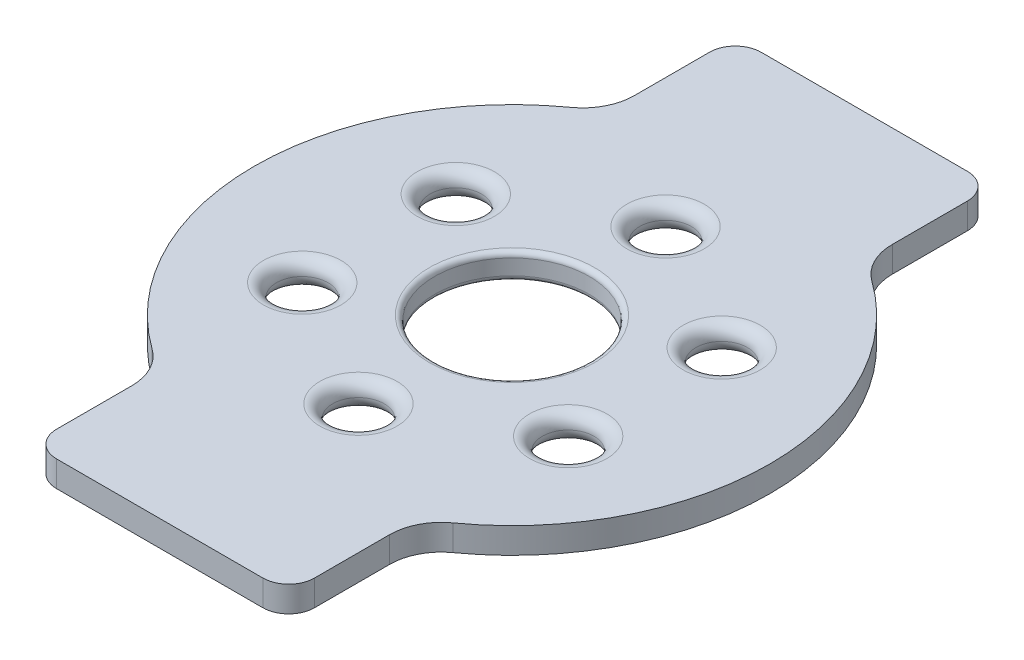
ISO-10303-21;
HEADER;
FILE_DESCRIPTION(('STEP AP214'),'2;1');
FILE_NAME('part.step','',(''),(''),'','','');
FILE_SCHEMA(('AUTOMOTIVE_DESIGN { 1 0 10303 214 1 1 1 1 }'));
ENDSEC;
DATA;
#1=APPLICATION_CONTEXT('core data for automotive mechanical design processes');
#2=APPLICATION_PROTOCOL_DEFINITION('international standard','automotive_design',2000,#1);
#3=PRODUCT_CONTEXT('',#1,'mechanical');
#4=PRODUCT('Part','Part','',(#3));
#5=PRODUCT_RELATED_PRODUCT_CATEGORY('part','',(#4));
#6=PRODUCT_DEFINITION_FORMATION('','',#4);
#7=PRODUCT_DEFINITION_CONTEXT('part definition',#1,'design');
#8=PRODUCT_DEFINITION('design','',#6,#7);
#9=PRODUCT_DEFINITION_SHAPE('','',#8);
#10=(LENGTH_UNIT() NAMED_UNIT(*) SI_UNIT(.MILLI.,.METRE.));
#11=(NAMED_UNIT(*) PLANE_ANGLE_UNIT() SI_UNIT($,.RADIAN.));
#12=(NAMED_UNIT(*) SI_UNIT($,.STERADIAN.) SOLID_ANGLE_UNIT());
#13=UNCERTAINTY_MEASURE_WITH_UNIT(LENGTH_MEASURE(1.E-05),#10,'distance_accuracy_value','');
#14=(GEOMETRIC_REPRESENTATION_CONTEXT(3) GLOBAL_UNCERTAINTY_ASSIGNED_CONTEXT((#13)) GLOBAL_UNIT_ASSIGNED_CONTEXT((#10,
#11,#12)) REPRESENTATION_CONTEXT('',''));
#15=CARTESIAN_POINT('',(0.,0.,0.));
#16=DIRECTION('',(0.,0.,1.));
#17=DIRECTION('',(1.,0.,0.));
#18=AXIS2_PLACEMENT_3D('',#15,#16,#17);
#19=CARTESIAN_POINT('',(0.,10.,0.));
#20=DIRECTION('',(0.,1.,0.));
#21=DIRECTION('',(0.,0.,1.));
#22=AXIS2_PLACEMENT_3D('',#19,#20,#21);
#23=PLANE('',#22);
#24=CARTESIAN_POINT('',(51.5631503641405,10.,29.7699987430039));
#25=DIRECTION('',(0.,1.,0.));
#26=DIRECTION('',(0.,0.,1.));
#27=AXIS2_PLACEMENT_3D('',#24,#25,#26);
#28=CIRCLE('',#27,14.9999999999975);
#29=CARTESIAN_POINT('',(51.5631503641405,10.,44.7699987430015));
#30=VERTEX_POINT('',#29);
#31=EDGE_CURVE('E11',#30,#30,#28,.F.);
#32=ORIENTED_EDGE('',*,*,#31,.T.);
#33=EDGE_LOOP('',(#32));
#34=FACE_BOUND('',#33,.T.);
#35=CARTESIAN_POINT('',(51.5631503641432,10.,-29.7699987429992));
#36=DIRECTION('',(0.,1.,0.));
#37=DIRECTION('',(0.,0.,1.));
#38=AXIS2_PLACEMENT_3D('',#35,#36,#37);
#39=CIRCLE('',#38,14.9999999999959);
#40=CARTESIAN_POINT('',(51.5631503641432,10.,-14.7699987430033));
#41=VERTEX_POINT('',#40);
#42=EDGE_CURVE('E53',#41,#41,#39,.F.);
#43=ORIENTED_EDGE('',*,*,#42,.T.);
#44=EDGE_LOOP('',(#43));
#45=FACE_BOUND('',#44,.T.);
#46=CARTESIAN_POINT('',(-2.06969504090083E-12,10.,59.5399974860015));
#47=DIRECTION('',(0.,1.,0.));
#48=DIRECTION('',(0.,0.,1.));
#49=AXIS2_PLACEMENT_3D('',#46,#47,#48);
#50=CIRCLE('',#49,14.9999999999984);
#51=CARTESIAN_POINT('',(-2.06969504090083E-12,10.,74.5399974859999));
#52=VERTEX_POINT('',#51);
#53=EDGE_CURVE('E345',#52,#52,#50,.F.);
#54=ORIENTED_EDGE('',*,*,#53,.T.);
#55=EDGE_LOOP('',(#54));
#56=FACE_BOUND('',#55,.T.);
#57=CARTESIAN_POINT('',(3.36987392259975E-12,10.,-59.5399974860015));
#58=DIRECTION('',(0.,1.,0.));
#59=DIRECTION('',(0.,0.,1.));
#60=AXIS2_PLACEMENT_3D('',#57,#58,#59);
#61=CIRCLE('',#60,14.9999999999968);
#62=CARTESIAN_POINT('',(3.36987392259975E-12,10.,-44.5399974860048));
#63=VERTEX_POINT('',#62);
#64=EDGE_CURVE('E341',#63,#63,#61,.F.);
#65=ORIENTED_EDGE('',*,*,#64,.T.);
#66=EDGE_LOOP('',(#65));
#67=FACE_BOUND('',#66,.T.);
#68=CARTESIAN_POINT('',(-51.5631503641392,10.,29.7699987429945));
#69=DIRECTION('',(0.,1.,0.));
#70=DIRECTION('',(0.,0.,1.));
#71=AXIS2_PLACEMENT_3D('',#68,#69,#70);
#72=CIRCLE('',#71,14.999999999996);
#73=CARTESIAN_POINT('',(-51.5631503641392,10.,44.7699987429905));
#74=VERTEX_POINT('',#73);
#75=EDGE_CURVE('E337',#74,#74,#72,.F.);
#76=ORIENTED_EDGE('',*,*,#75,.T.);
#77=EDGE_LOOP('',(#76));
#78=FACE_BOUND('',#77,.T.);
#79=CARTESIAN_POINT('',(-51.563150364131,10.,-29.7699987430086));
#80=DIRECTION('',(0.,1.,0.));
#81=DIRECTION('',(0.,0.,1.));
#82=AXIS2_PLACEMENT_3D('',#79,#80,#81);
#83=CIRCLE('',#82,14.9999999999912);
#84=CARTESIAN_POINT('',(-51.563150364131,10.,-14.7699987430174));
#85=VERTEX_POINT('',#84);
#86=EDGE_CURVE('E333',#85,#85,#83,.F.);
#87=ORIENTED_EDGE('',*,*,#86,.T.);
#88=EDGE_LOOP('',(#87));
#89=FACE_BOUND('',#88,.T.);
#90=CARTESIAN_POINT('',(0.,10.,0.));
#91=DIRECTION('',(0.,1.,0.));
#92=DIRECTION('',(0.,0.,1.));
#93=AXIS2_PLACEMENT_3D('',#90,#91,#92);
#94=CIRCLE('',#93,32.);
#95=CARTESIAN_POINT('',(0.,10.,32.));
#96=VERTEX_POINT('',#95);
#97=EDGE_CURVE('E252',#96,#96,#94,.F.);
#98=ORIENTED_EDGE('',*,*,#97,.T.);
#99=EDGE_LOOP('',(#98));
#100=FACE_BOUND('',#99,.T.);
#101=DIRECTION('',(0.,0.,-1.));
#102=VECTOR('',#101,1.);
#103=CARTESIAN_POINT('',(50.,10.,-86.6025403784439));
#104=LINE('',#103,#102);
#105=CARTESIAN_POINT('',(50.,10.,-97.4679434480897));
#106=VERTEX_POINT('',#105);
#107=CARTESIAN_POINT('',(50.,10.,-126.602540378444));
#108=VERTEX_POINT('',#107);
#109=EDGE_CURVE('E178',#106,#108,#104,.T.);
#110=ORIENTED_EDGE('',*,*,#109,.T.);
#111=CARTESIAN_POINT('',(40.,10.,-126.602540378444));
#112=DIRECTION('',(0.,1.,0.));
#113=DIRECTION('',(0.,0.,1.));
#114=AXIS2_PLACEMENT_3D('',#111,#112,#113);
#115=CIRCLE('',#114,10.);
#116=CARTESIAN_POINT('',(40.,10.,-136.602540378444));
#117=VERTEX_POINT('',#116);
#118=EDGE_CURVE('E302',#108,#117,#115,.T.);
#119=ORIENTED_EDGE('',*,*,#118,.T.);
#120=DIRECTION('',(-1.,0.,0.));
#121=VECTOR('',#120,1.);
#122=CARTESIAN_POINT('',(-50.,10.,-136.602540378444));
#123=LINE('',#122,#121);
#124=CARTESIAN_POINT('',(-40.,10.,-136.602540378444));
#125=VERTEX_POINT('',#124);
#126=EDGE_CURVE('E181',#117,#125,#123,.T.);
#127=ORIENTED_EDGE('',*,*,#126,.T.);
#128=CARTESIAN_POINT('',(-40.,10.,-126.602540378444));
#129=DIRECTION('',(0.,1.,0.));
#130=DIRECTION('',(0.,0.,1.));
#131=AXIS2_PLACEMENT_3D('',#128,#129,#130);
#132=CIRCLE('',#131,10.);
#133=CARTESIAN_POINT('',(-50.,10.,-126.602540378444));
#134=VERTEX_POINT('',#133);
#135=EDGE_CURVE('E61',#125,#134,#132,.T.);
#136=ORIENTED_EDGE('',*,*,#135,.T.);
#137=DIRECTION('',(0.,0.,1.));
#138=VECTOR('',#137,1.);
#139=CARTESIAN_POINT('',(-50.,10.,-86.6025403784439));
#140=LINE('',#139,#138);
#141=CARTESIAN_POINT('',(-50.,10.,-97.4679434480897));
#142=VERTEX_POINT('',#141);
#143=EDGE_CURVE('E193',#134,#142,#140,.T.);
#144=ORIENTED_EDGE('',*,*,#143,.T.);
#145=CARTESIAN_POINT('',(-70.,10.,-97.4679434480897));
#146=DIRECTION('',(0.,1.,0.));
#147=DIRECTION('',(0.,0.,1.));
#148=AXIS2_PLACEMENT_3D('',#145,#146,#147);
#149=CIRCLE('',#148,20.);
#150=CARTESIAN_POINT('',(-58.3333333333333,10.,-81.2232862067414));
#151=VERTEX_POINT('',#150);
#152=EDGE_CURVE('E228',#142,#151,#149,.F.);
#153=ORIENTED_EDGE('',*,*,#152,.T.);
#154=CARTESIAN_POINT('',(0.,10.,0.));
#155=DIRECTION('',(0.,1.,0.));
#156=DIRECTION('',(0.,0.,1.));
#157=AXIS2_PLACEMENT_3D('',#154,#155,#156);
#158=CIRCLE('',#157,100.);
#159=CARTESIAN_POINT('',(-58.3333333333333,10.,81.2232862067414));
#160=VERTEX_POINT('',#159);
#161=EDGE_CURVE('E525',#151,#160,#158,.T.);
#162=ORIENTED_EDGE('',*,*,#161,.T.);
#163=CARTESIAN_POINT('',(-70.,10.,97.4679434480897));
#164=DIRECTION('',(0.,1.,0.));
#165=DIRECTION('',(0.,0.,1.));
#166=AXIS2_PLACEMENT_3D('',#163,#164,#165);
#167=CIRCLE('',#166,20.);
#168=CARTESIAN_POINT('',(-50.,10.,97.4679434480897));
#169=VERTEX_POINT('',#168);
#170=EDGE_CURVE('E234',#160,#169,#167,.F.);
#171=ORIENTED_EDGE('',*,*,#170,.T.);
#172=DIRECTION('',(0.,0.,1.));
#173=VECTOR('',#172,1.);
#174=CARTESIAN_POINT('',(-50.,10.,86.6025403784439));
#175=LINE('',#174,#173);
#176=CARTESIAN_POINT('',(-50.,10.,126.602540378444));
#177=VERTEX_POINT('',#176);
#178=EDGE_CURVE('E529',#169,#177,#175,.T.);
#179=ORIENTED_EDGE('',*,*,#178,.T.);
#180=CARTESIAN_POINT('',(-40.,10.,126.602540378444));
#181=DIRECTION('',(0.,1.,0.));
#182=DIRECTION('',(0.,0.,1.));
#183=AXIS2_PLACEMENT_3D('',#180,#181,#182);
#184=CIRCLE('',#183,10.);
#185=CARTESIAN_POINT('',(-40.,10.,136.602540378444));
#186=VERTEX_POINT('',#185);
#187=EDGE_CURVE('E279',#177,#186,#184,.T.);
#188=ORIENTED_EDGE('',*,*,#187,.T.);
#189=DIRECTION('',(1.,0.,0.));
#190=VECTOR('',#189,1.);
#191=CARTESIAN_POINT('',(-50.,10.,136.602540378444));
#192=LINE('',#191,#190);
#193=CARTESIAN_POINT('',(40.,10.,136.602540378444));
#194=VERTEX_POINT('',#193);
#195=EDGE_CURVE('E535',#186,#194,#192,.T.);
#196=ORIENTED_EDGE('',*,*,#195,.T.);
#197=CARTESIAN_POINT('',(40.,10.,126.602540378444));
#198=DIRECTION('',(0.,1.,0.));
#199=DIRECTION('',(0.,0.,1.));
#200=AXIS2_PLACEMENT_3D('',#197,#198,#199);
#201=CIRCLE('',#200,10.);
#202=CARTESIAN_POINT('',(50.,10.,126.602540378444));
#203=VERTEX_POINT('',#202);
#204=EDGE_CURVE('E276',#194,#203,#201,.T.);
#205=ORIENTED_EDGE('',*,*,#204,.T.);
#206=DIRECTION('',(0.,0.,-1.));
#207=VECTOR('',#206,1.);
#208=CARTESIAN_POINT('',(50.,10.,86.6025403784439));
#209=LINE('',#208,#207);
#210=CARTESIAN_POINT('',(50.,10.,97.4679434480897));
#211=VERTEX_POINT('',#210);
#212=EDGE_CURVE('E539',#203,#211,#209,.T.);
#213=ORIENTED_EDGE('',*,*,#212,.T.);
#214=CARTESIAN_POINT('',(70.,10.,97.4679434480897));
#215=DIRECTION('',(0.,1.,0.));
#216=DIRECTION('',(0.,0.,1.));
#217=AXIS2_PLACEMENT_3D('',#214,#215,#216);
#218=CIRCLE('',#217,20.);
#219=CARTESIAN_POINT('',(58.3333333333333,10.,81.2232862067414));
#220=VERTEX_POINT('',#219);
#221=EDGE_CURVE('E241',#211,#220,#218,.F.);
#222=ORIENTED_EDGE('',*,*,#221,.T.);
#223=CARTESIAN_POINT('',(0.,10.,0.));
#224=DIRECTION('',(0.,1.,0.));
#225=DIRECTION('',(0.,0.,1.));
#226=AXIS2_PLACEMENT_3D('',#223,#224,#225);
#227=CIRCLE('',#226,100.);
#228=CARTESIAN_POINT('',(58.3333333333333,10.,-81.2232862067414));
#229=VERTEX_POINT('',#228);
#230=EDGE_CURVE('E516',#220,#229,#227,.T.);
#231=ORIENTED_EDGE('',*,*,#230,.T.);
#232=CARTESIAN_POINT('',(70.,10.,-97.4679434480897));
#233=DIRECTION('',(0.,1.,0.));
#234=DIRECTION('',(0.,0.,1.));
#235=AXIS2_PLACEMENT_3D('',#232,#233,#234);
#236=CIRCLE('',#235,20.);
#237=EDGE_CURVE('E173',#229,#106,#236,.F.);
#238=ORIENTED_EDGE('',*,*,#237,.T.);
#239=EDGE_LOOP('',(#110,#119,#127,#136,#144,#153,#162,#171,#179,#188,#196,#205,#213,#222,#231,#238));
#240=FACE_BOUND('',#239,.T.);
#241=ADVANCED_FACE('F43',(#34,#45,#56,#67,#78,#89,#100,#240),#23,.T.);
#242=CARTESIAN_POINT('',(0.,0.,0.));
#243=DIRECTION('',(0.,1.,0.));
#244=DIRECTION('',(0.,0.,1.));
#245=AXIS2_PLACEMENT_3D('',#242,#243,#244);
#246=PLANE('',#245);
#247=CARTESIAN_POINT('',(51.5631503641405,0.,29.7699987430039));
#248=DIRECTION('',(0.,1.,0.));
#249=DIRECTION('',(0.,0.,1.));
#250=AXIS2_PLACEMENT_3D('',#247,#248,#249);
#251=CIRCLE('',#250,14.9999999999975);
#252=CARTESIAN_POINT('',(51.5631503641405,0.,44.7699987430015));
#253=VERTEX_POINT('',#252);
#254=EDGE_CURVE('E329',#253,#253,#251,.T.);
#255=ORIENTED_EDGE('',*,*,#254,.T.);
#256=EDGE_LOOP('',(#255));
#257=FACE_BOUND('',#256,.T.);
#258=CARTESIAN_POINT('',(51.5631503641432,0.,-29.7699987429992));
#259=DIRECTION('',(0.,1.,0.));
#260=DIRECTION('',(0.,0.,1.));
#261=AXIS2_PLACEMENT_3D('',#258,#259,#260);
#262=CIRCLE('',#261,14.9999999999959);
#263=CARTESIAN_POINT('',(51.5631503641432,0.,-14.7699987430033));
#264=VERTEX_POINT('',#263);
#265=EDGE_CURVE('E325',#264,#264,#262,.T.);
#266=ORIENTED_EDGE('',*,*,#265,.T.);
#267=EDGE_LOOP('',(#266));
#268=FACE_BOUND('',#267,.T.);
#269=CARTESIAN_POINT('',(-2.06969504090083E-12,0.,59.5399974860015));
#270=DIRECTION('',(0.,1.,0.));
#271=DIRECTION('',(0.,0.,1.));
#272=AXIS2_PLACEMENT_3D('',#269,#270,#271);
#273=CIRCLE('',#272,14.9999999999984);
#274=CARTESIAN_POINT('',(-2.06969504090083E-12,0.,74.5399974859999));
#275=VERTEX_POINT('',#274);
#276=EDGE_CURVE('E321',#275,#275,#273,.T.);
#277=ORIENTED_EDGE('',*,*,#276,.T.);
#278=EDGE_LOOP('',(#277));
#279=FACE_BOUND('',#278,.T.);
#280=CARTESIAN_POINT('',(3.36987392259975E-12,0.,-59.5399974860015));
#281=DIRECTION('',(0.,1.,0.));
#282=DIRECTION('',(0.,0.,1.));
#283=AXIS2_PLACEMENT_3D('',#280,#281,#282);
#284=CIRCLE('',#283,14.9999999999968);
#285=CARTESIAN_POINT('',(3.36987392259975E-12,0.,-44.5399974860048));
#286=VERTEX_POINT('',#285);
#287=EDGE_CURVE('E317',#286,#286,#284,.T.);
#288=ORIENTED_EDGE('',*,*,#287,.T.);
#289=EDGE_LOOP('',(#288));
#290=FACE_BOUND('',#289,.T.);
#291=CARTESIAN_POINT('',(-51.5631503641392,0.,29.7699987429945));
#292=DIRECTION('',(0.,1.,0.));
#293=DIRECTION('',(0.,0.,1.));
#294=AXIS2_PLACEMENT_3D('',#291,#292,#293);
#295=CIRCLE('',#294,14.999999999996);
#296=CARTESIAN_POINT('',(-51.5631503641392,0.,44.7699987429905));
#297=VERTEX_POINT('',#296);
#298=EDGE_CURVE('E313',#297,#297,#295,.T.);
#299=ORIENTED_EDGE('',*,*,#298,.T.);
#300=EDGE_LOOP('',(#299));
#301=FACE_BOUND('',#300,.T.);
#302=CARTESIAN_POINT('',(-51.563150364131,0.,-29.7699987430086));
#303=DIRECTION('',(0.,1.,0.));
#304=DIRECTION('',(0.,0.,1.));
#305=AXIS2_PLACEMENT_3D('',#302,#303,#304);
#306=CIRCLE('',#305,14.9999999999912);
#307=CARTESIAN_POINT('',(-51.563150364131,0.,-14.7699987430174));
#308=VERTEX_POINT('',#307);
#309=EDGE_CURVE('E309',#308,#308,#306,.T.);
#310=ORIENTED_EDGE('',*,*,#309,.T.);
#311=EDGE_LOOP('',(#310));
#312=FACE_BOUND('',#311,.T.);
#313=CARTESIAN_POINT('',(0.,0.,0.));
#314=DIRECTION('',(0.,1.,0.));
#315=DIRECTION('',(0.,0.,1.));
#316=AXIS2_PLACEMENT_3D('',#313,#314,#315);
#317=CIRCLE('',#316,32.);
#318=CARTESIAN_POINT('',(0.,0.,32.));
#319=VERTEX_POINT('',#318);
#320=EDGE_CURVE('E256',#319,#319,#317,.T.);
#321=ORIENTED_EDGE('',*,*,#320,.T.);
#322=EDGE_LOOP('',(#321));
#323=FACE_BOUND('',#322,.T.);
#324=DIRECTION('',(-1.,0.,0.));
#325=VECTOR('',#324,1.);
#326=CARTESIAN_POINT('',(-50.,0.,-136.602540378444));
#327=LINE('',#326,#325);
#328=CARTESIAN_POINT('',(40.,0.,-136.602540378444));
#329=VERTEX_POINT('',#328);
#330=CARTESIAN_POINT('',(-40.,0.,-136.602540378444));
#331=VERTEX_POINT('',#330);
#332=EDGE_CURVE('E187',#329,#331,#327,.T.);
#333=ORIENTED_EDGE('',*,*,#332,.F.);
#334=CARTESIAN_POINT('',(40.,0.,-126.602540378444));
#335=DIRECTION('',(0.,1.,0.));
#336=DIRECTION('',(0.,0.,1.));
#337=AXIS2_PLACEMENT_3D('',#334,#335,#336);
#338=CIRCLE('',#337,10.);
#339=CARTESIAN_POINT('',(50.,0.,-126.602540378444));
#340=VERTEX_POINT('',#339);
#341=EDGE_CURVE('E185',#329,#340,#338,.F.);
#342=ORIENTED_EDGE('',*,*,#341,.T.);
#343=DIRECTION('',(0.,0.,-1.));
#344=VECTOR('',#343,1.);
#345=CARTESIAN_POINT('',(50.,0.,-86.6025403784439));
#346=LINE('',#345,#344);
#347=CARTESIAN_POINT('',(50.,0.,-97.4679434480897));
#348=VERTEX_POINT('',#347);
#349=EDGE_CURVE('E177',#348,#340,#346,.T.);
#350=ORIENTED_EDGE('',*,*,#349,.F.);
#351=CARTESIAN_POINT('',(70.,0.,-97.4679434480897));
#352=DIRECTION('',(0.,1.,0.));
#353=DIRECTION('',(0.,0.,1.));
#354=AXIS2_PLACEMENT_3D('',#351,#352,#353);
#355=CIRCLE('',#354,20.);
#356=CARTESIAN_POINT('',(58.3333333333333,0.,-81.2232862067414));
#357=VERTEX_POINT('',#356);
#358=EDGE_CURVE('E162',#348,#357,#355,.T.);
#359=ORIENTED_EDGE('',*,*,#358,.T.);
#360=CARTESIAN_POINT('',(0.,0.,0.));
#361=DIRECTION('',(0.,1.,0.));
#362=DIRECTION('',(0.,0.,1.));
#363=AXIS2_PLACEMENT_3D('',#360,#361,#362);
#364=CIRCLE('',#363,100.);
#365=CARTESIAN_POINT('',(58.3333333333333,0.,81.2232862067414));
#366=VERTEX_POINT('',#365);
#367=EDGE_CURVE('E188',#366,#357,#364,.T.);
#368=ORIENTED_EDGE('',*,*,#367,.F.);
#369=CARTESIAN_POINT('',(70.,0.,97.4679434480897));
#370=DIRECTION('',(0.,1.,0.));
#371=DIRECTION('',(0.,0.,1.));
#372=AXIS2_PLACEMENT_3D('',#369,#370,#371);
#373=CIRCLE('',#372,20.);
#374=CARTESIAN_POINT('',(50.,0.,97.4679434480897));
#375=VERTEX_POINT('',#374);
#376=EDGE_CURVE('E237',#366,#375,#373,.T.);
#377=ORIENTED_EDGE('',*,*,#376,.T.);
#378=DIRECTION('',(0.,0.,-1.));
#379=VECTOR('',#378,1.);
#380=CARTESIAN_POINT('',(50.,0.,86.6025403784439));
#381=LINE('',#380,#379);
#382=CARTESIAN_POINT('',(50.,0.,126.602540378444));
#383=VERTEX_POINT('',#382);
#384=EDGE_CURVE('E195',#383,#375,#381,.T.);
#385=ORIENTED_EDGE('',*,*,#384,.F.);
#386=CARTESIAN_POINT('',(40.,0.,126.602540378444));
#387=DIRECTION('',(0.,1.,0.));
#388=DIRECTION('',(0.,0.,1.));
#389=AXIS2_PLACEMENT_3D('',#386,#387,#388);
#390=CIRCLE('',#389,10.);
#391=CARTESIAN_POINT('',(40.,0.,136.602540378444));
#392=VERTEX_POINT('',#391);
#393=EDGE_CURVE('E267',#383,#392,#390,.F.);
#394=ORIENTED_EDGE('',*,*,#393,.T.);
#395=DIRECTION('',(1.,0.,0.));
#396=VECTOR('',#395,1.);
#397=CARTESIAN_POINT('',(-50.,0.,136.602540378444));
#398=LINE('',#397,#396);
#399=CARTESIAN_POINT('',(-40.,0.,136.602540378444));
#400=VERTEX_POINT('',#399);
#401=EDGE_CURVE('E556',#400,#392,#398,.T.);
#402=ORIENTED_EDGE('',*,*,#401,.F.);
#403=CARTESIAN_POINT('',(-40.,0.,126.602540378444));
#404=DIRECTION('',(0.,1.,0.));
#405=DIRECTION('',(0.,0.,1.));
#406=AXIS2_PLACEMENT_3D('',#403,#404,#405);
#407=CIRCLE('',#406,10.);
#408=CARTESIAN_POINT('',(-50.,0.,126.602540378444));
#409=VERTEX_POINT('',#408);
#410=EDGE_CURVE('E270',#400,#409,#407,.F.);
#411=ORIENTED_EDGE('',*,*,#410,.T.);
#412=DIRECTION('',(0.,0.,1.));
#413=VECTOR('',#412,1.);
#414=CARTESIAN_POINT('',(-50.,0.,86.6025403784439));
#415=LINE('',#414,#413);
#416=CARTESIAN_POINT('',(-50.,0.,97.4679434480897));
#417=VERTEX_POINT('',#416);
#418=EDGE_CURVE('E552',#417,#409,#415,.T.);
#419=ORIENTED_EDGE('',*,*,#418,.F.);
#420=CARTESIAN_POINT('',(-70.,0.,97.4679434480897));
#421=DIRECTION('',(0.,1.,0.));
#422=DIRECTION('',(0.,0.,1.));
#423=AXIS2_PLACEMENT_3D('',#420,#421,#422);
#424=CIRCLE('',#423,20.);
#425=CARTESIAN_POINT('',(-58.3333333333333,0.,81.2232862067414));
#426=VERTEX_POINT('',#425);
#427=EDGE_CURVE('E231',#417,#426,#424,.T.);
#428=ORIENTED_EDGE('',*,*,#427,.T.);
#429=CARTESIAN_POINT('',(0.,0.,0.));
#430=DIRECTION('',(0.,1.,0.));
#431=DIRECTION('',(0.,0.,1.));
#432=AXIS2_PLACEMENT_3D('',#429,#430,#431);
#433=CIRCLE('',#432,100.);
#434=CARTESIAN_POINT('',(-58.3333333333333,0.,-81.2232862067414));
#435=VERTEX_POINT('',#434);
#436=EDGE_CURVE('E548',#435,#426,#433,.T.);
#437=ORIENTED_EDGE('',*,*,#436,.F.);
#438=CARTESIAN_POINT('',(-70.,0.,-97.4679434480897));
#439=DIRECTION('',(0.,1.,0.));
#440=DIRECTION('',(0.,0.,1.));
#441=AXIS2_PLACEMENT_3D('',#438,#439,#440);
#442=CIRCLE('',#441,20.);
#443=CARTESIAN_POINT('',(-50.,0.,-97.4679434480897));
#444=VERTEX_POINT('',#443);
#445=EDGE_CURVE('E224',#435,#444,#442,.T.);
#446=ORIENTED_EDGE('',*,*,#445,.T.);
#447=DIRECTION('',(0.,0.,1.));
#448=VECTOR('',#447,1.);
#449=CARTESIAN_POINT('',(-50.,0.,-86.6025403784439));
#450=LINE('',#449,#448);
#451=CARTESIAN_POINT('',(-50.,0.,-126.602540378444));
#452=VERTEX_POINT('',#451);
#453=EDGE_CURVE('E356',#452,#444,#450,.T.);
#454=ORIENTED_EDGE('',*,*,#453,.F.);
#455=CARTESIAN_POINT('',(-40.,0.,-126.602540378444));
#456=DIRECTION('',(0.,1.,0.));
#457=DIRECTION('',(0.,0.,1.));
#458=AXIS2_PLACEMENT_3D('',#455,#456,#457);
#459=CIRCLE('',#458,10.);
#460=EDGE_CURVE('E293',#452,#331,#459,.F.);
#461=ORIENTED_EDGE('',*,*,#460,.T.);
#462=EDGE_LOOP('',(#333,#342,#350,#359,#368,#377,#385,#394,#402,#411,#419,#428,#437,#446,#454,#461));
#463=FACE_BOUND('',#462,.T.);
#464=ADVANCED_FACE('F184',(#257,#268,#279,#290,#301,#312,#323,#463),#246,.F.);
#465=CARTESIAN_POINT('',(-50.,10.,-86.6025403784439));
#466=DIRECTION('',(1.,0.,0.));
#467=DIRECTION('',(0.,0.,-1.));
#468=AXIS2_PLACEMENT_3D('',#465,#466,#467);
#469=PLANE('',#468);
#470=ORIENTED_EDGE('',*,*,#143,.F.);
#471=DIRECTION('',(0.,-1.,0.));
#472=VECTOR('',#471,1.);
#473=CARTESIAN_POINT('',(-50.,10.,-126.602540378444));
#474=LINE('',#473,#472);
#475=EDGE_CURVE('E305',#134,#452,#474,.T.);
#476=ORIENTED_EDGE('',*,*,#475,.T.);
#477=ORIENTED_EDGE('',*,*,#453,.T.);
#478=DIRECTION('',(0.,1.,0.));
#479=VECTOR('',#478,1.);
#480=CARTESIAN_POINT('',(-50.,10.,-97.4679434480897));
#481=LINE('',#480,#479);
#482=EDGE_CURVE('E211',#444,#142,#481,.T.);
#483=ORIENTED_EDGE('',*,*,#482,.T.);
#484=EDGE_LOOP('',(#470,#476,#477,#483));
#485=FACE_BOUND('',#484,.T.);
#486=ADVANCED_FACE('F396',(#485),#469,.F.);
#487=CARTESIAN_POINT('',(0.,10.,0.));
#488=DIRECTION('',(0.,-1.,0.));
#489=DIRECTION('',(0.,0.,-1.));
#490=AXIS2_PLACEMENT_3D('',#487,#488,#489);
#491=CYLINDRICAL_SURFACE('',#490,100.);
#492=ORIENTED_EDGE('',*,*,#161,.F.);
#493=DIRECTION('',(0.,-1.,0.));
#494=VECTOR('',#493,1.);
#495=CARTESIAN_POINT('',(-58.3333333333333,10.,-81.2232862067414));
#496=LINE('',#495,#494);
#497=EDGE_CURVE('E207',#151,#435,#496,.T.);
#498=ORIENTED_EDGE('',*,*,#497,.T.);
#499=ORIENTED_EDGE('',*,*,#436,.T.);
#500=DIRECTION('',(0.,-1.,0.));
#501=VECTOR('',#500,1.);
#502=CARTESIAN_POINT('',(-58.3333333333333,10.,81.2232862067414));
#503=LINE('',#502,#501);
#504=EDGE_CURVE('E204',#426,#160,#503,.F.);
#505=ORIENTED_EDGE('',*,*,#504,.T.);
#506=EDGE_LOOP('',(#492,#498,#499,#505));
#507=FACE_BOUND('',#506,.T.);
#508=ADVANCED_FACE('F424',(#507),#491,.T.);
#509=CARTESIAN_POINT('',(-50.,10.,86.6025403784439));
#510=DIRECTION('',(1.,0.,0.));
#511=DIRECTION('',(0.,0.,-1.));
#512=AXIS2_PLACEMENT_3D('',#509,#510,#511);
#513=PLANE('',#512);
#514=ORIENTED_EDGE('',*,*,#418,.T.);
#515=DIRECTION('',(0.,-1.,0.));
#516=VECTOR('',#515,1.);
#517=CARTESIAN_POINT('',(-50.,10.,126.602540378444));
#518=LINE('',#517,#516);
#519=EDGE_CURVE('E273',#409,#177,#518,.F.);
#520=ORIENTED_EDGE('',*,*,#519,.T.);
#521=ORIENTED_EDGE('',*,*,#178,.F.);
#522=DIRECTION('',(0.,1.,0.));
#523=VECTOR('',#522,1.);
#524=CARTESIAN_POINT('',(-50.,0.,97.4679434480897));
#525=LINE('',#524,#523);
#526=EDGE_CURVE('E215',#169,#417,#525,.F.);
#527=ORIENTED_EDGE('',*,*,#526,.T.);
#528=EDGE_LOOP('',(#514,#520,#521,#527));
#529=FACE_BOUND('',#528,.T.);
#530=ADVANCED_FACE('F420',(#529),#513,.F.);
#531=CARTESIAN_POINT('',(-50.,10.,136.602540378444));
#532=DIRECTION('',(0.,0.,-1.));
#533=DIRECTION('',(-1.,0.,0.));
#534=AXIS2_PLACEMENT_3D('',#531,#532,#533);
#535=PLANE('',#534);
#536=ORIENTED_EDGE('',*,*,#195,.F.);
#537=DIRECTION('',(0.,-1.,0.));
#538=VECTOR('',#537,1.);
#539=CARTESIAN_POINT('',(-40.,10.,136.602540378444));
#540=LINE('',#539,#538);
#541=EDGE_CURVE('E263',#186,#400,#540,.T.);
#542=ORIENTED_EDGE('',*,*,#541,.T.);
#543=ORIENTED_EDGE('',*,*,#401,.T.);
#544=DIRECTION('',(0.,-1.,0.));
#545=VECTOR('',#544,1.);
#546=CARTESIAN_POINT('',(40.,10.,136.602540378444));
#547=LINE('',#546,#545);
#548=EDGE_CURVE('E260',#392,#194,#547,.F.);
#549=ORIENTED_EDGE('',*,*,#548,.T.);
#550=EDGE_LOOP('',(#536,#542,#543,#549));
#551=FACE_BOUND('',#550,.T.);
#552=ADVANCED_FACE('F416',(#551),#535,.F.);
#553=CARTESIAN_POINT('',(50.,10.,86.6025403784439));
#554=DIRECTION('',(-1.,0.,0.));
#555=DIRECTION('',(0.,0.,1.));
#556=AXIS2_PLACEMENT_3D('',#553,#554,#555);
#557=PLANE('',#556);
#558=ORIENTED_EDGE('',*,*,#212,.F.);
#559=DIRECTION('',(0.,-1.,0.));
#560=VECTOR('',#559,1.);
#561=CARTESIAN_POINT('',(50.,10.,126.602540378444));
#562=LINE('',#561,#560);
#563=EDGE_CURVE('E282',#203,#383,#562,.T.);
#564=ORIENTED_EDGE('',*,*,#563,.T.);
#565=ORIENTED_EDGE('',*,*,#384,.T.);
#566=DIRECTION('',(0.,1.,0.));
#567=VECTOR('',#566,1.);
#568=CARTESIAN_POINT('',(50.,10.,97.4679434480897));
#569=LINE('',#568,#567);
#570=EDGE_CURVE('E174',#375,#211,#569,.T.);
#571=ORIENTED_EDGE('',*,*,#570,.T.);
#572=EDGE_LOOP('',(#558,#564,#565,#571));
#573=FACE_BOUND('',#572,.T.);
#574=ADVANCED_FACE('F412',(#573),#557,.F.);
#575=CARTESIAN_POINT('',(0.,10.,0.));
#576=DIRECTION('',(0.,-1.,0.));
#577=DIRECTION('',(0.,0.,-1.));
#578=AXIS2_PLACEMENT_3D('',#575,#576,#577);
#579=CYLINDRICAL_SURFACE('',#578,100.);
#580=ORIENTED_EDGE('',*,*,#367,.T.);
#581=DIRECTION('',(0.,-1.,0.));
#582=VECTOR('',#581,1.);
#583=CARTESIAN_POINT('',(58.3333333333333,10.,-81.2232862067414));
#584=LINE('',#583,#582);
#585=EDGE_CURVE('E167',#357,#229,#584,.F.);
#586=ORIENTED_EDGE('',*,*,#585,.T.);
#587=ORIENTED_EDGE('',*,*,#230,.F.);
#588=DIRECTION('',(0.,-1.,0.));
#589=VECTOR('',#588,1.);
#590=CARTESIAN_POINT('',(58.3333333333333,10.,81.2232862067414));
#591=LINE('',#590,#589);
#592=EDGE_CURVE('E180',#220,#366,#591,.T.);
#593=ORIENTED_EDGE('',*,*,#592,.T.);
#594=EDGE_LOOP('',(#580,#586,#587,#593));
#595=FACE_BOUND('',#594,.T.);
#596=ADVANCED_FACE('F409',(#595),#579,.T.);
#597=CARTESIAN_POINT('',(50.,10.,-86.6025403784439));
#598=DIRECTION('',(-1.,0.,0.));
#599=DIRECTION('',(0.,0.,1.));
#600=AXIS2_PLACEMENT_3D('',#597,#598,#599);
#601=PLANE('',#600);
#602=ORIENTED_EDGE('',*,*,#349,.T.);
#603=DIRECTION('',(0.,-1.,0.));
#604=VECTOR('',#603,1.);
#605=CARTESIAN_POINT('',(50.,10.,-126.602540378444));
#606=LINE('',#605,#604);
#607=EDGE_CURVE('E69',#340,#108,#606,.F.);
#608=ORIENTED_EDGE('',*,*,#607,.T.);
#609=ORIENTED_EDGE('',*,*,#109,.F.);
#610=DIRECTION('',(0.,1.,0.));
#611=VECTOR('',#610,1.);
#612=CARTESIAN_POINT('',(50.,0.,-97.4679434480897));
#613=LINE('',#612,#611);
#614=EDGE_CURVE('E166',#106,#348,#613,.F.);
#615=ORIENTED_EDGE('',*,*,#614,.T.);
#616=EDGE_LOOP('',(#602,#608,#609,#615));
#617=FACE_BOUND('',#616,.T.);
#618=ADVANCED_FACE('F176',(#617),#601,.F.);
#619=CARTESIAN_POINT('',(-50.,10.,-136.602540378444));
#620=DIRECTION('',(0.,0.,1.));
#621=DIRECTION('',(1.,0.,0.));
#622=AXIS2_PLACEMENT_3D('',#619,#620,#621);
#623=PLANE('',#622);
#624=ORIENTED_EDGE('',*,*,#126,.F.);
#625=DIRECTION('',(0.,-1.,0.));
#626=VECTOR('',#625,1.);
#627=CARTESIAN_POINT('',(40.,10.,-136.602540378444));
#628=LINE('',#627,#626);
#629=EDGE_CURVE('E289',#117,#329,#628,.T.);
#630=ORIENTED_EDGE('',*,*,#629,.T.);
#631=ORIENTED_EDGE('',*,*,#332,.T.);
#632=DIRECTION('',(0.,-1.,0.));
#633=VECTOR('',#632,1.);
#634=CARTESIAN_POINT('',(-40.,10.,-136.602540378444));
#635=LINE('',#634,#633);
#636=EDGE_CURVE('E286',#331,#125,#635,.F.);
#637=ORIENTED_EDGE('',*,*,#636,.T.);
#638=EDGE_LOOP('',(#624,#630,#631,#637));
#639=FACE_BOUND('',#638,.T.);
#640=ADVANCED_FACE('F403',(#639),#623,.F.);
#641=CARTESIAN_POINT('',(0.,10.,0.));
#642=DIRECTION('',(0.,-1.,0.));
#643=DIRECTION('',(0.,0.,-1.));
#644=AXIS2_PLACEMENT_3D('',#641,#642,#643);
#645=CYLINDRICAL_SURFACE('',#644,30.);
#646=CARTESIAN_POINT('',(0.,8.,0.));
#647=DIRECTION('',(0.,1.,0.));
#648=DIRECTION('',(0.,0.,1.));
#649=AXIS2_PLACEMENT_3D('',#646,#647,#648);
#650=CIRCLE('',#649,30.);
#651=CARTESIAN_POINT('',(0.,8.,30.));
#652=VERTEX_POINT('',#651);
#653=EDGE_CURVE('E248',#652,#652,#650,.T.);
#654=ORIENTED_EDGE('',*,*,#653,.T.);
#655=EDGE_LOOP('',(#654));
#656=FACE_BOUND('',#655,.T.);
#657=CARTESIAN_POINT('',(0.,2.,0.));
#658=DIRECTION('',(0.,1.,0.));
#659=DIRECTION('',(0.,0.,1.));
#660=AXIS2_PLACEMENT_3D('',#657,#658,#659);
#661=CIRCLE('',#660,30.);
#662=CARTESIAN_POINT('',(0.,2.,30.));
#663=VERTEX_POINT('',#662);
#664=EDGE_CURVE('E244',#663,#663,#661,.F.);
#665=ORIENTED_EDGE('',*,*,#664,.T.);
#666=EDGE_LOOP('',(#665));
#667=FACE_BOUND('',#666,.T.);
#668=ADVANCED_FACE('F401',(#656,#667),#645,.F.);
#669=CARTESIAN_POINT('',(70.,10.,-97.4679434480897));
#670=DIRECTION('',(0.,-1.,0.));
#671=DIRECTION('',(0.,0.,-1.));
#672=AXIS2_PLACEMENT_3D('',#669,#670,#671);
#673=CYLINDRICAL_SURFACE('',#672,20.);
#674=ORIENTED_EDGE('',*,*,#237,.F.);
#675=ORIENTED_EDGE('',*,*,#585,.F.);
#676=ORIENTED_EDGE('',*,*,#358,.F.);
#677=ORIENTED_EDGE('',*,*,#614,.F.);
#678=EDGE_LOOP('',(#674,#675,#676,#677));
#679=FACE_BOUND('',#678,.T.);
#680=ADVANCED_FACE('F165',(#679),#673,.F.);
#681=CARTESIAN_POINT('',(-70.,10.,-97.4679434480897));
#682=DIRECTION('',(0.,-1.,0.));
#683=DIRECTION('',(0.,0.,-1.));
#684=AXIS2_PLACEMENT_3D('',#681,#682,#683);
#685=CYLINDRICAL_SURFACE('',#684,20.);
#686=ORIENTED_EDGE('',*,*,#152,.F.);
#687=ORIENTED_EDGE('',*,*,#482,.F.);
#688=ORIENTED_EDGE('',*,*,#445,.F.);
#689=ORIENTED_EDGE('',*,*,#497,.F.);
#690=EDGE_LOOP('',(#686,#687,#688,#689));
#691=FACE_BOUND('',#690,.T.);
#692=ADVANCED_FACE('F434',(#691),#685,.F.);
#693=CARTESIAN_POINT('',(-70.,10.,97.4679434480897));
#694=DIRECTION('',(0.,-1.,0.));
#695=DIRECTION('',(0.,0.,-1.));
#696=AXIS2_PLACEMENT_3D('',#693,#694,#695);
#697=CYLINDRICAL_SURFACE('',#696,20.);
#698=ORIENTED_EDGE('',*,*,#170,.F.);
#699=ORIENTED_EDGE('',*,*,#504,.F.);
#700=ORIENTED_EDGE('',*,*,#427,.F.);
#701=ORIENTED_EDGE('',*,*,#526,.F.);
#702=EDGE_LOOP('',(#698,#699,#700,#701));
#703=FACE_BOUND('',#702,.T.);
#704=ADVANCED_FACE('F437',(#703),#697,.F.);
#705=CARTESIAN_POINT('',(70.,10.,97.4679434480897));
#706=DIRECTION('',(0.,-1.,0.));
#707=DIRECTION('',(0.,0.,-1.));
#708=AXIS2_PLACEMENT_3D('',#705,#706,#707);
#709=CYLINDRICAL_SURFACE('',#708,20.);
#710=ORIENTED_EDGE('',*,*,#221,.F.);
#711=ORIENTED_EDGE('',*,*,#570,.F.);
#712=ORIENTED_EDGE('',*,*,#376,.F.);
#713=ORIENTED_EDGE('',*,*,#592,.F.);
#714=EDGE_LOOP('',(#710,#711,#712,#713));
#715=FACE_BOUND('',#714,.T.);
#716=ADVANCED_FACE('F441',(#715),#709,.F.);
#717=CARTESIAN_POINT('',(0.,8.,0.));
#718=DIRECTION('',(0.,1.,0.));
#719=DIRECTION('',(0.,0.,1.));
#720=AXIS2_PLACEMENT_3D('',#717,#718,#719);
#721=TOROIDAL_SURFACE('',#720,32.,2.);
#722=ORIENTED_EDGE('',*,*,#97,.F.);
#723=EDGE_LOOP('',(#722));
#724=FACE_BOUND('',#723,.T.);
#725=ORIENTED_EDGE('',*,*,#653,.F.);
#726=EDGE_LOOP('',(#725));
#727=FACE_BOUND('',#726,.T.);
#728=ADVANCED_FACE('F445',(#724,#727),#721,.T.);
#729=CARTESIAN_POINT('',(0.,2.,0.));
#730=DIRECTION('',(0.,1.,0.));
#731=DIRECTION('',(0.,0.,1.));
#732=AXIS2_PLACEMENT_3D('',#729,#730,#731);
#733=TOROIDAL_SURFACE('',#732,32.,2.);
#734=ORIENTED_EDGE('',*,*,#664,.F.);
#735=EDGE_LOOP('',(#734));
#736=FACE_BOUND('',#735,.T.);
#737=ORIENTED_EDGE('',*,*,#320,.F.);
#738=EDGE_LOOP('',(#737));
#739=FACE_BOUND('',#738,.T.);
#740=ADVANCED_FACE('F449',(#736,#739),#733,.T.);
#741=CARTESIAN_POINT('',(-40.,10.,126.602540378444));
#742=DIRECTION('',(0.,-1.,0.));
#743=DIRECTION('',(0.,0.,-1.));
#744=AXIS2_PLACEMENT_3D('',#741,#742,#743);
#745=CYLINDRICAL_SURFACE('',#744,10.);
#746=ORIENTED_EDGE('',*,*,#187,.F.);
#747=ORIENTED_EDGE('',*,*,#519,.F.);
#748=ORIENTED_EDGE('',*,*,#410,.F.);
#749=ORIENTED_EDGE('',*,*,#541,.F.);
#750=EDGE_LOOP('',(#746,#747,#748,#749));
#751=FACE_BOUND('',#750,.T.);
#752=ADVANCED_FACE('F453',(#751),#745,.T.);
#753=CARTESIAN_POINT('',(40.,10.,126.602540378444));
#754=DIRECTION('',(0.,-1.,0.));
#755=DIRECTION('',(0.,0.,-1.));
#756=AXIS2_PLACEMENT_3D('',#753,#754,#755);
#757=CYLINDRICAL_SURFACE('',#756,10.);
#758=ORIENTED_EDGE('',*,*,#204,.F.);
#759=ORIENTED_EDGE('',*,*,#548,.F.);
#760=ORIENTED_EDGE('',*,*,#393,.F.);
#761=ORIENTED_EDGE('',*,*,#563,.F.);
#762=EDGE_LOOP('',(#758,#759,#760,#761));
#763=FACE_BOUND('',#762,.T.);
#764=ADVANCED_FACE('F457',(#763),#757,.T.);
#765=CARTESIAN_POINT('',(40.,10.,-126.602540378444));
#766=DIRECTION('',(0.,-1.,0.));
#767=DIRECTION('',(0.,0.,-1.));
#768=AXIS2_PLACEMENT_3D('',#765,#766,#767);
#769=CYLINDRICAL_SURFACE('',#768,10.);
#770=ORIENTED_EDGE('',*,*,#118,.F.);
#771=ORIENTED_EDGE('',*,*,#607,.F.);
#772=ORIENTED_EDGE('',*,*,#341,.F.);
#773=ORIENTED_EDGE('',*,*,#629,.F.);
#774=EDGE_LOOP('',(#770,#771,#772,#773));
#775=FACE_BOUND('',#774,.T.);
#776=ADVANCED_FACE('F461',(#775),#769,.T.);
#777=CARTESIAN_POINT('',(-40.,10.,-126.602540378444));
#778=DIRECTION('',(0.,-1.,0.));
#779=DIRECTION('',(0.,0.,-1.));
#780=AXIS2_PLACEMENT_3D('',#777,#778,#779);
#781=CYLINDRICAL_SURFACE('',#780,10.);
#782=ORIENTED_EDGE('',*,*,#135,.F.);
#783=ORIENTED_EDGE('',*,*,#636,.F.);
#784=ORIENTED_EDGE('',*,*,#460,.F.);
#785=ORIENTED_EDGE('',*,*,#475,.F.);
#786=EDGE_LOOP('',(#782,#783,#784,#785));
#787=FACE_BOUND('',#786,.T.);
#788=ADVANCED_FACE('F465',(#787),#781,.T.);
#789=CARTESIAN_POINT('',(51.5631503641405,5.,29.7699987430039));
#790=DIRECTION('',(0.,1.,0.));
#791=DIRECTION('',(0.,0.,1.));
#792=AXIS2_PLACEMENT_3D('',#789,#790,#791);
#793=TOROIDAL_SURFACE('',#792,14.9999999999975,5.);
#794=ORIENTED_EDGE('',*,*,#31,.F.);
#795=EDGE_LOOP('',(#794));
#796=FACE_BOUND('',#795,.T.);
#797=CARTESIAN_POINT('',(51.5631503641405,5.,29.7699987430039));
#798=DIRECTION('',(0.,1.,0.));
#799=DIRECTION('',(0.,0.,1.));
#800=AXIS2_PLACEMENT_3D('',#797,#798,#799);
#801=CIRCLE('',#800,9.99999999999754);
#802=CARTESIAN_POINT('',(51.5631503641405,5.,39.7699987430015));
#803=VERTEX_POINT('',#802);
#804=EDGE_CURVE('E352',#803,#803,#801,.T.);
#805=ORIENTED_EDGE('',*,*,#804,.F.);
#806=EDGE_LOOP('',(#805));
#807=FACE_BOUND('',#806,.T.);
#808=ADVANCED_FACE('F469',(#796,#807),#793,.T.);
#809=CARTESIAN_POINT('',(51.5631503641405,5.,29.7699987430039));
#810=DIRECTION('',(0.,1.,0.));
#811=DIRECTION('',(0.,0.,1.));
#812=AXIS2_PLACEMENT_3D('',#809,#810,#811);
#813=TOROIDAL_SURFACE('',#812,14.9999999999975,5.);
#814=ORIENTED_EDGE('',*,*,#804,.T.);
#815=EDGE_LOOP('',(#814));
#816=FACE_BOUND('',#815,.T.);
#817=ORIENTED_EDGE('',*,*,#254,.F.);
#818=EDGE_LOOP('',(#817));
#819=FACE_BOUND('',#818,.T.);
#820=ADVANCED_FACE('F471',(#816,#819),#813,.T.);
#821=CARTESIAN_POINT('',(51.5631503641432,5.,-29.7699987429992));
#822=DIRECTION('',(0.,1.,0.));
#823=DIRECTION('',(0.,0.,1.));
#824=AXIS2_PLACEMENT_3D('',#821,#822,#823);
#825=TOROIDAL_SURFACE('',#824,14.9999999999959,5.);
#826=ORIENTED_EDGE('',*,*,#42,.F.);
#827=EDGE_LOOP('',(#826));
#828=FACE_BOUND('',#827,.T.);
#829=CARTESIAN_POINT('',(51.5631503641432,5.,-29.7699987429992));
#830=DIRECTION('',(0.,1.,0.));
#831=DIRECTION('',(0.,0.,1.));
#832=AXIS2_PLACEMENT_3D('',#829,#830,#831);
#833=CIRCLE('',#832,9.99999999999594);
#834=CARTESIAN_POINT('',(51.5631503641432,5.,-19.7699987430033));
#835=VERTEX_POINT('',#834);
#836=EDGE_CURVE('E357',#835,#835,#833,.T.);
#837=ORIENTED_EDGE('',*,*,#836,.F.);
#838=EDGE_LOOP('',(#837));
#839=FACE_BOUND('',#838,.T.);
#840=ADVANCED_FACE('F474',(#828,#839),#825,.T.);
#841=CARTESIAN_POINT('',(51.5631503641432,5.,-29.7699987429992));
#842=DIRECTION('',(0.,1.,0.));
#843=DIRECTION('',(0.,0.,1.));
#844=AXIS2_PLACEMENT_3D('',#841,#842,#843);
#845=TOROIDAL_SURFACE('',#844,14.9999999999959,5.);
#846=ORIENTED_EDGE('',*,*,#836,.T.);
#847=EDGE_LOOP('',(#846));
#848=FACE_BOUND('',#847,.T.);
#849=ORIENTED_EDGE('',*,*,#265,.F.);
#850=EDGE_LOOP('',(#849));
#851=FACE_BOUND('',#850,.T.);
#852=ADVANCED_FACE('F479',(#848,#851),#845,.T.);
#853=CARTESIAN_POINT('',(-2.06969504090083E-12,5.,59.5399974860015));
#854=DIRECTION('',(0.,1.,0.));
#855=DIRECTION('',(0.,0.,1.));
#856=AXIS2_PLACEMENT_3D('',#853,#854,#855);
#857=TOROIDAL_SURFACE('',#856,14.9999999999984,5.);
#858=ORIENTED_EDGE('',*,*,#53,.F.);
#859=EDGE_LOOP('',(#858));
#860=FACE_BOUND('',#859,.T.);
#861=CARTESIAN_POINT('',(-2.06969504090083E-12,5.,59.5399974860015));
#862=DIRECTION('',(0.,1.,0.));
#863=DIRECTION('',(0.,0.,1.));
#864=AXIS2_PLACEMENT_3D('',#861,#862,#863);
#865=CIRCLE('',#864,9.99999999999842);
#866=CARTESIAN_POINT('',(-2.06969504090083E-12,5.,69.5399974859999));
#867=VERTEX_POINT('',#866);
#868=EDGE_CURVE('E361',#867,#867,#865,.T.);
#869=ORIENTED_EDGE('',*,*,#868,.F.);
#870=EDGE_LOOP('',(#869));
#871=FACE_BOUND('',#870,.T.);
#872=ADVANCED_FACE('F482',(#860,#871),#857,.T.);
#873=CARTESIAN_POINT('',(-2.06969504090083E-12,5.,59.5399974860015));
#874=DIRECTION('',(0.,1.,0.));
#875=DIRECTION('',(0.,0.,1.));
#876=AXIS2_PLACEMENT_3D('',#873,#874,#875);
#877=TOROIDAL_SURFACE('',#876,14.9999999999984,5.);
#878=ORIENTED_EDGE('',*,*,#868,.T.);
#879=EDGE_LOOP('',(#878));
#880=FACE_BOUND('',#879,.T.);
#881=ORIENTED_EDGE('',*,*,#276,.F.);
#882=EDGE_LOOP('',(#881));
#883=FACE_BOUND('',#882,.T.);
#884=ADVANCED_FACE('F487',(#880,#883),#877,.T.);
#885=CARTESIAN_POINT('',(3.36987392259975E-12,5.,-59.5399974860015));
#886=DIRECTION('',(0.,1.,0.));
#887=DIRECTION('',(0.,0.,1.));
#888=AXIS2_PLACEMENT_3D('',#885,#886,#887);
#889=TOROIDAL_SURFACE('',#888,14.9999999999968,5.);
#890=ORIENTED_EDGE('',*,*,#64,.F.);
#891=EDGE_LOOP('',(#890));
#892=FACE_BOUND('',#891,.T.);
#893=CARTESIAN_POINT('',(3.36987392259975E-12,5.,-59.5399974860015));
#894=DIRECTION('',(0.,1.,0.));
#895=DIRECTION('',(0.,0.,1.));
#896=AXIS2_PLACEMENT_3D('',#893,#894,#895);
#897=CIRCLE('',#896,9.99999999999678);
#898=CARTESIAN_POINT('',(3.36987392259975E-12,5.,-49.5399974860048));
#899=VERTEX_POINT('',#898);
#900=EDGE_CURVE('E365',#899,#899,#897,.T.);
#901=ORIENTED_EDGE('',*,*,#900,.F.);
#902=EDGE_LOOP('',(#901));
#903=FACE_BOUND('',#902,.T.);
#904=ADVANCED_FACE('F490',(#892,#903),#889,.T.);
#905=CARTESIAN_POINT('',(3.36987392259975E-12,5.,-59.5399974860015));
#906=DIRECTION('',(0.,1.,0.));
#907=DIRECTION('',(0.,0.,1.));
#908=AXIS2_PLACEMENT_3D('',#905,#906,#907);
#909=TOROIDAL_SURFACE('',#908,14.9999999999968,5.);
#910=ORIENTED_EDGE('',*,*,#900,.T.);
#911=EDGE_LOOP('',(#910));
#912=FACE_BOUND('',#911,.T.);
#913=ORIENTED_EDGE('',*,*,#287,.F.);
#914=EDGE_LOOP('',(#913));
#915=FACE_BOUND('',#914,.T.);
#916=ADVANCED_FACE('F495',(#912,#915),#909,.T.);
#917=CARTESIAN_POINT('',(-51.5631503641392,5.,29.7699987429945));
#918=DIRECTION('',(0.,1.,0.));
#919=DIRECTION('',(0.,0.,1.));
#920=AXIS2_PLACEMENT_3D('',#917,#918,#919);
#921=TOROIDAL_SURFACE('',#920,14.999999999996,5.);
#922=ORIENTED_EDGE('',*,*,#75,.F.);
#923=EDGE_LOOP('',(#922));
#924=FACE_BOUND('',#923,.T.);
#925=CARTESIAN_POINT('',(-51.5631503641392,5.,29.7699987429945));
#926=DIRECTION('',(0.,1.,0.));
#927=DIRECTION('',(0.,0.,1.));
#928=AXIS2_PLACEMENT_3D('',#925,#926,#927);
#929=CIRCLE('',#928,9.99999999999605);
#930=CARTESIAN_POINT('',(-51.5631503641392,5.,39.7699987429905));
#931=VERTEX_POINT('',#930);
#932=EDGE_CURVE('E368',#931,#931,#929,.T.);
#933=ORIENTED_EDGE('',*,*,#932,.F.);
#934=EDGE_LOOP('',(#933));
#935=FACE_BOUND('',#934,.T.);
#936=ADVANCED_FACE('F387',(#924,#935),#921,.T.);
#937=CARTESIAN_POINT('',(-51.5631503641392,5.,29.7699987429945));
#938=DIRECTION('',(0.,1.,0.));
#939=DIRECTION('',(0.,0.,1.));
#940=AXIS2_PLACEMENT_3D('',#937,#938,#939);
#941=TOROIDAL_SURFACE('',#940,14.999999999996,5.);
#942=ORIENTED_EDGE('',*,*,#932,.T.);
#943=EDGE_LOOP('',(#942));
#944=FACE_BOUND('',#943,.T.);
#945=ORIENTED_EDGE('',*,*,#298,.F.);
#946=EDGE_LOOP('',(#945));
#947=FACE_BOUND('',#946,.T.);
#948=ADVANCED_FACE('F381',(#944,#947),#941,.T.);
#949=CARTESIAN_POINT('',(-51.563150364131,5.,-29.7699987430086));
#950=DIRECTION('',(0.,1.,0.));
#951=DIRECTION('',(0.,0.,1.));
#952=AXIS2_PLACEMENT_3D('',#949,#950,#951);
#953=TOROIDAL_SURFACE('',#952,14.9999999999912,5.);
#954=ORIENTED_EDGE('',*,*,#86,.F.);
#955=EDGE_LOOP('',(#954));
#956=FACE_BOUND('',#955,.T.);
#957=CARTESIAN_POINT('',(-51.563150364131,5.,-29.7699987430086));
#958=DIRECTION('',(0.,1.,0.));
#959=DIRECTION('',(0.,0.,1.));
#960=AXIS2_PLACEMENT_3D('',#957,#958,#959);
#961=CIRCLE('',#960,9.99999999999121);
#962=CARTESIAN_POINT('',(-51.563150364131,5.,-19.7699987430174));
#963=VERTEX_POINT('',#962);
#964=EDGE_CURVE('E47',#963,#963,#961,.T.);
#965=ORIENTED_EDGE('',*,*,#964,.F.);
#966=EDGE_LOOP('',(#965));
#967=FACE_BOUND('',#966,.T.);
#968=ADVANCED_FACE('F45',(#956,#967),#953,.T.);
#969=CARTESIAN_POINT('',(-51.563150364131,5.,-29.7699987430086));
#970=DIRECTION('',(0.,1.,0.));
#971=DIRECTION('',(0.,0.,1.));
#972=AXIS2_PLACEMENT_3D('',#969,#970,#971);
#973=TOROIDAL_SURFACE('',#972,14.9999999999912,5.);
#974=ORIENTED_EDGE('',*,*,#964,.T.);
#975=EDGE_LOOP('',(#974));
#976=FACE_BOUND('',#975,.T.);
#977=ORIENTED_EDGE('',*,*,#309,.F.);
#978=EDGE_LOOP('',(#977));
#979=FACE_BOUND('',#978,.T.);
#980=ADVANCED_FACE('F377',(#976,#979),#973,.T.);
#981=CLOSED_SHELL('',(#241,#464,#486,#508,#530,#552,#574,#596,#618,#640,#668,#680,#692,#704,
#716,#728,#740,#752,#764,#776,#788,#808,#820,#840,#852,#872,#884,#904,#916,#936,#948,#968,#980));
#982=MANIFOLD_SOLID_BREP('B2',#981);
#983=ADVANCED_BREP_SHAPE_REPRESENTATION('',(#18,#982),#14);
#984=SHAPE_DEFINITION_REPRESENTATION(#9,#983);
ENDSEC;
END-ISO-10303-21;
